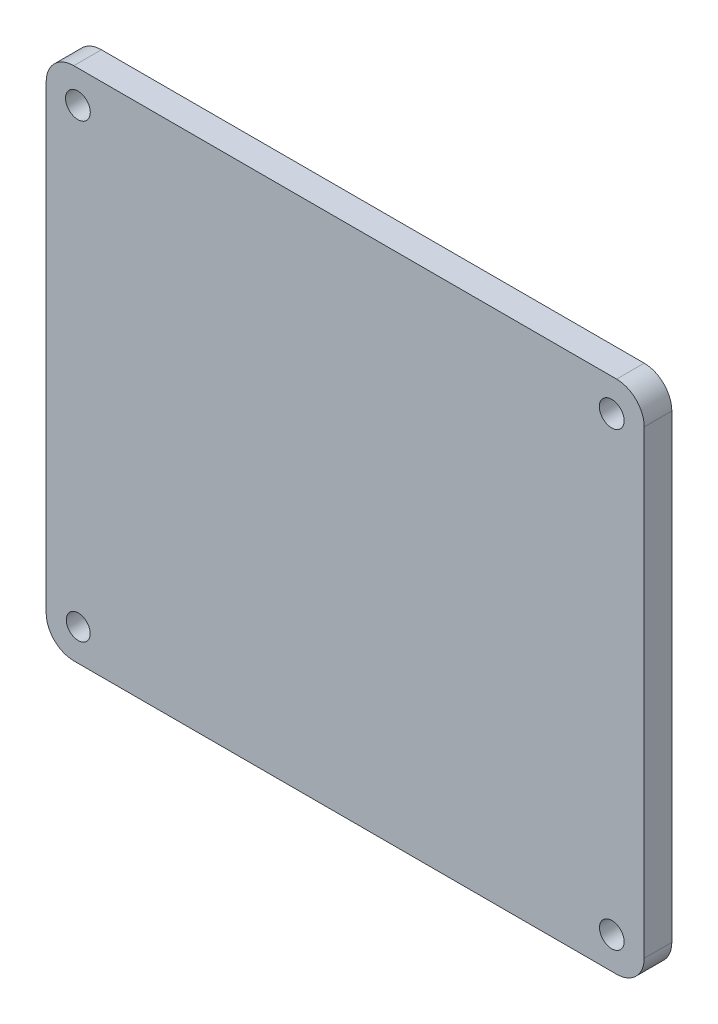
ISO-10303-21;
HEADER;
FILE_DESCRIPTION(('STEP AP214'),'2;1');
FILE_NAME('part.step','',(''),(''),'','','');
FILE_SCHEMA(('AUTOMOTIVE_DESIGN { 1 0 10303 214 1 1 1 1 }'));
ENDSEC;
DATA;
#1=APPLICATION_CONTEXT('core data for automotive mechanical design processes');
#2=APPLICATION_PROTOCOL_DEFINITION('international standard','automotive_design',2000,#1);
#3=PRODUCT_CONTEXT('',#1,'mechanical');
#4=PRODUCT('Part','Part','',(#3));
#5=PRODUCT_RELATED_PRODUCT_CATEGORY('part','',(#4));
#6=PRODUCT_DEFINITION_FORMATION('','',#4);
#7=PRODUCT_DEFINITION_CONTEXT('part definition',#1,'design');
#8=PRODUCT_DEFINITION('design','',#6,#7);
#9=PRODUCT_DEFINITION_SHAPE('','',#8);
#10=(LENGTH_UNIT() NAMED_UNIT(*) SI_UNIT(.MILLI.,.METRE.));
#11=(NAMED_UNIT(*) PLANE_ANGLE_UNIT() SI_UNIT($,.RADIAN.));
#12=(NAMED_UNIT(*) SI_UNIT($,.STERADIAN.) SOLID_ANGLE_UNIT());
#13=UNCERTAINTY_MEASURE_WITH_UNIT(LENGTH_MEASURE(1.E-05),#10,'distance_accuracy_value','');
#14=(GEOMETRIC_REPRESENTATION_CONTEXT(3) GLOBAL_UNCERTAINTY_ASSIGNED_CONTEXT((#13)) GLOBAL_UNIT_ASSIGNED_CONTEXT((#10,
#11,#12)) REPRESENTATION_CONTEXT('',''));
#15=CARTESIAN_POINT('',(0.,0.,0.));
#16=DIRECTION('',(0.,0.,1.));
#17=DIRECTION('',(1.,0.,0.));
#18=AXIS2_PLACEMENT_3D('',#15,#16,#17);
#19=CARTESIAN_POINT('',(201.871913251507,253.348131253436,3.));
#20=DIRECTION('',(0.,0.,-1.));
#21=DIRECTION('',(-1.,0.,0.));
#22=AXIS2_PLACEMENT_3D('',#19,#20,#21);
#23=PLANE('',#22);
#24=CARTESIAN_POINT('',(201.871913251507,253.348131253436,3.));
#25=DIRECTION('',(0.,0.,1.));
#26=DIRECTION('',(-1.,0.,0.));
#27=AXIS2_PLACEMENT_3D('',#24,#25,#26);
#28=CIRCLE('',#27,3.);
#29=CARTESIAN_POINT('',(201.871913251507,250.348131253436,3.));
#30=VERTEX_POINT('',#29);
#31=CARTESIAN_POINT('',(204.871913251507,253.348131253436,3.));
#32=VERTEX_POINT('',#31);
#33=EDGE_CURVE('E164',#30,#32,#28,.T.);
#34=ORIENTED_EDGE('',*,*,#33,.T.);
#35=DIRECTION('',(0.,1.,0.));
#36=VECTOR('',#35,1.);
#37=CARTESIAN_POINT('',(204.871913251507,303.333520822125,3.));
#38=LINE('',#37,#36);
#39=CARTESIAN_POINT('',(204.871913251507,303.333520822125,3.));
#40=VERTEX_POINT('',#39);
#41=EDGE_CURVE('E100',#32,#40,#38,.T.);
#42=ORIENTED_EDGE('',*,*,#41,.T.);
#43=CARTESIAN_POINT('',(201.871913251507,303.333520822125,3.));
#44=DIRECTION('',(0.,0.,1.));
#45=DIRECTION('',(-1.,0.,0.));
#46=AXIS2_PLACEMENT_3D('',#43,#44,#45);
#47=CIRCLE('',#46,3.);
#48=CARTESIAN_POINT('',(201.871913251507,306.333520822125,3.));
#49=VERTEX_POINT('',#48);
#50=EDGE_CURVE('E185',#40,#49,#47,.T.);
#51=ORIENTED_EDGE('',*,*,#50,.T.);
#52=DIRECTION('',(-1.,0.,0.));
#53=VECTOR('',#52,1.);
#54=CARTESIAN_POINT('',(142.914343154071,306.333520822125,3.));
#55=LINE('',#54,#53);
#56=CARTESIAN_POINT('',(142.914343154071,306.333520822125,3.));
#57=VERTEX_POINT('',#56);
#58=EDGE_CURVE('E199',#49,#57,#55,.T.);
#59=ORIENTED_EDGE('',*,*,#58,.T.);
#60=CARTESIAN_POINT('',(142.914343154071,303.333520822125,3.));
#61=DIRECTION('',(0.,0.,1.));
#62=DIRECTION('',(1.,0.,0.));
#63=AXIS2_PLACEMENT_3D('',#60,#61,#62);
#64=CIRCLE('',#63,3.);
#65=CARTESIAN_POINT('',(139.914343154071,303.333520822125,3.));
#66=VERTEX_POINT('',#65);
#67=EDGE_CURVE('E119',#57,#66,#64,.T.);
#68=ORIENTED_EDGE('',*,*,#67,.T.);
#69=DIRECTION('',(0.,-1.,0.));
#70=VECTOR('',#69,1.);
#71=CARTESIAN_POINT('',(139.914343154071,253.348131253436,3.));
#72=LINE('',#71,#70);
#73=CARTESIAN_POINT('',(139.914343154071,253.348131253436,3.));
#74=VERTEX_POINT('',#73);
#75=EDGE_CURVE('E113',#66,#74,#72,.T.);
#76=ORIENTED_EDGE('',*,*,#75,.T.);
#77=CARTESIAN_POINT('',(142.914343154071,253.348131253436,3.));
#78=DIRECTION('',(0.,0.,1.));
#79=DIRECTION('',(-1.,0.,0.));
#80=AXIS2_PLACEMENT_3D('',#77,#78,#79);
#81=CIRCLE('',#80,3.);
#82=CARTESIAN_POINT('',(142.914343154071,250.348131253436,3.));
#83=VERTEX_POINT('',#82);
#84=EDGE_CURVE('E117',#74,#83,#81,.T.);
#85=ORIENTED_EDGE('',*,*,#84,.T.);
#86=DIRECTION('',(1.,0.,0.));
#87=VECTOR('',#86,1.);
#88=CARTESIAN_POINT('',(201.871913251507,250.348131253436,3.));
#89=LINE('',#88,#87);
#90=EDGE_CURVE('E57',#83,#30,#89,.T.);
#91=ORIENTED_EDGE('',*,*,#90,.T.);
#92=EDGE_LOOP('',(#34,#42,#51,#59,#68,#76,#85,#91));
#93=FACE_BOUND('',#92,.T.);
#94=CARTESIAN_POINT('',(143.360544481449,302.831604494432,3.));
#95=DIRECTION('',(0.,0.,1.));
#96=DIRECTION('',(1.,0.,0.));
#97=AXIS2_PLACEMENT_3D('',#94,#95,#96);
#98=CIRCLE('',#97,1.34534522063001);
#99=CARTESIAN_POINT('',(144.705889702079,302.831604494432,3.));
#100=VERTEX_POINT('',#99);
#101=EDGE_CURVE('E146',#100,#100,#98,.T.);
#102=ORIENTED_EDGE('',*,*,#101,.F.);
#103=EDGE_LOOP('',(#102));
#104=FACE_BOUND('',#103,.T.);
#105=CARTESIAN_POINT('',(201.344684378207,302.818633302361,3.));
#106=DIRECTION('',(0.,0.,1.));
#107=DIRECTION('',(1.,0.,0.));
#108=AXIS2_PLACEMENT_3D('',#105,#106,#107);
#109=CIRCLE('',#108,1.34690922053071);
#110=CARTESIAN_POINT('',(202.691593598737,302.818633302361,3.));
#111=VERTEX_POINT('',#110);
#112=EDGE_CURVE('E213',#111,#111,#109,.T.);
#113=ORIENTED_EDGE('',*,*,#112,.F.);
#114=EDGE_LOOP('',(#113));
#115=FACE_BOUND('',#114,.T.);
#116=CARTESIAN_POINT('',(143.395469298573,253.802031827382,3.));
#117=DIRECTION('',(0.,0.,1.));
#118=DIRECTION('',(1.,0.,0.));
#119=AXIS2_PLACEMENT_3D('',#116,#117,#118);
#120=CIRCLE('',#119,1.29861131616477);
#121=CARTESIAN_POINT('',(144.694080614738,253.802031827382,3.));
#122=VERTEX_POINT('',#121);
#123=EDGE_CURVE('E221',#122,#122,#120,.T.);
#124=ORIENTED_EDGE('',*,*,#123,.F.);
#125=EDGE_LOOP('',(#124));
#126=FACE_BOUND('',#125,.T.);
#127=CARTESIAN_POINT('',(201.354862045578,253.815125267861,3.));
#128=DIRECTION('',(0.,0.,1.));
#129=DIRECTION('',(1.,0.,0.));
#130=AXIS2_PLACEMENT_3D('',#127,#128,#129);
#131=CIRCLE('',#130,1.3356837614244);
#132=CARTESIAN_POINT('',(202.690545807002,253.815125267861,3.));
#133=VERTEX_POINT('',#132);
#134=EDGE_CURVE('E229',#133,#133,#131,.T.);
#135=ORIENTED_EDGE('',*,*,#134,.F.);
#136=EDGE_LOOP('',(#135));
#137=FACE_BOUND('',#136,.T.);
#138=ADVANCED_FACE('F39',(#93,#104,#115,#126,#137),#23,.F.);
#139=CARTESIAN_POINT('',(201.871913251507,253.348131253436,0.));
#140=DIRECTION('',(0.,0.,-1.));
#141=DIRECTION('',(-1.,0.,0.));
#142=AXIS2_PLACEMENT_3D('',#139,#140,#141);
#143=PLANE('',#142);
#144=CARTESIAN_POINT('',(143.395469298573,253.802031827382,0.));
#145=DIRECTION('',(0.,0.,1.));
#146=DIRECTION('',(1.,0.,0.));
#147=AXIS2_PLACEMENT_3D('',#144,#145,#146);
#148=CIRCLE('',#147,1.29861131616477);
#149=CARTESIAN_POINT('',(144.694080614738,253.802031827382,0.));
#150=VERTEX_POINT('',#149);
#151=EDGE_CURVE('E225',#150,#150,#148,.T.);
#152=ORIENTED_EDGE('',*,*,#151,.T.);
#153=EDGE_LOOP('',(#152));
#154=FACE_BOUND('',#153,.T.);
#155=CARTESIAN_POINT('',(143.360544481449,302.831604494432,0.));
#156=DIRECTION('',(0.,0.,1.));
#157=DIRECTION('',(1.,0.,0.));
#158=AXIS2_PLACEMENT_3D('',#155,#156,#157);
#159=CIRCLE('',#158,1.34534522063001);
#160=CARTESIAN_POINT('',(144.705889702079,302.831604494432,0.));
#161=VERTEX_POINT('',#160);
#162=EDGE_CURVE('E209',#161,#161,#159,.T.);
#163=ORIENTED_EDGE('',*,*,#162,.T.);
#164=EDGE_LOOP('',(#163));
#165=FACE_BOUND('',#164,.T.);
#166=CARTESIAN_POINT('',(201.871913251507,253.348131253436,0.));
#167=DIRECTION('',(0.,0.,1.));
#168=DIRECTION('',(-1.,0.,0.));
#169=AXIS2_PLACEMENT_3D('',#166,#167,#168);
#170=CIRCLE('',#169,3.);
#171=CARTESIAN_POINT('',(201.871913251507,250.348131253436,0.));
#172=VERTEX_POINT('',#171);
#173=CARTESIAN_POINT('',(204.871913251507,253.348131253436,0.));
#174=VERTEX_POINT('',#173);
#175=EDGE_CURVE('E141',#172,#174,#170,.T.);
#176=ORIENTED_EDGE('',*,*,#175,.F.);
#177=DIRECTION('',(1.,0.,0.));
#178=VECTOR('',#177,1.);
#179=CARTESIAN_POINT('',(201.871913251507,250.348131253436,0.));
#180=LINE('',#179,#178);
#181=CARTESIAN_POINT('',(142.914343154071,250.348131253436,0.));
#182=VERTEX_POINT('',#181);
#183=EDGE_CURVE('E92',#182,#172,#180,.T.);
#184=ORIENTED_EDGE('',*,*,#183,.F.);
#185=CARTESIAN_POINT('',(142.914343154071,253.348131253436,0.));
#186=DIRECTION('',(0.,0.,1.));
#187=DIRECTION('',(-1.,0.,0.));
#188=AXIS2_PLACEMENT_3D('',#185,#186,#187);
#189=CIRCLE('',#188,3.);
#190=CARTESIAN_POINT('',(139.914343154071,253.348131253436,0.));
#191=VERTEX_POINT('',#190);
#192=EDGE_CURVE('E86',#191,#182,#189,.T.);
#193=ORIENTED_EDGE('',*,*,#192,.F.);
#194=DIRECTION('',(0.,-1.,0.));
#195=VECTOR('',#194,1.);
#196=CARTESIAN_POINT('',(139.914343154071,253.348131253436,0.));
#197=LINE('',#196,#195);
#198=CARTESIAN_POINT('',(139.914343154071,303.333520822125,0.));
#199=VERTEX_POINT('',#198);
#200=EDGE_CURVE('E128',#199,#191,#197,.T.);
#201=ORIENTED_EDGE('',*,*,#200,.F.);
#202=CARTESIAN_POINT('',(142.914343154071,303.333520822125,0.));
#203=DIRECTION('',(0.,0.,1.));
#204=DIRECTION('',(1.,0.,0.));
#205=AXIS2_PLACEMENT_3D('',#202,#203,#204);
#206=CIRCLE('',#205,3.);
#207=CARTESIAN_POINT('',(142.914343154071,306.333520822125,0.));
#208=VERTEX_POINT('',#207);
#209=EDGE_CURVE('E155',#208,#199,#206,.T.);
#210=ORIENTED_EDGE('',*,*,#209,.F.);
#211=DIRECTION('',(-1.,0.,0.));
#212=VECTOR('',#211,1.);
#213=CARTESIAN_POINT('',(142.914343154071,306.333520822125,0.));
#214=LINE('',#213,#212);
#215=CARTESIAN_POINT('',(201.871913251507,306.333520822125,0.));
#216=VERTEX_POINT('',#215);
#217=EDGE_CURVE('E152',#216,#208,#214,.T.);
#218=ORIENTED_EDGE('',*,*,#217,.F.);
#219=CARTESIAN_POINT('',(201.871913251507,303.333520822125,0.));
#220=DIRECTION('',(0.,0.,1.));
#221=DIRECTION('',(-1.,0.,0.));
#222=AXIS2_PLACEMENT_3D('',#219,#220,#221);
#223=CIRCLE('',#222,3.);
#224=CARTESIAN_POINT('',(204.871913251507,303.333520822125,0.));
#225=VERTEX_POINT('',#224);
#226=EDGE_CURVE('E149',#225,#216,#223,.T.);
#227=ORIENTED_EDGE('',*,*,#226,.F.);
#228=DIRECTION('',(0.,1.,0.));
#229=VECTOR('',#228,1.);
#230=CARTESIAN_POINT('',(204.871913251507,303.333520822125,0.));
#231=LINE('',#230,#229);
#232=EDGE_CURVE('E145',#174,#225,#231,.T.);
#233=ORIENTED_EDGE('',*,*,#232,.F.);
#234=EDGE_LOOP('',(#176,#184,#193,#201,#210,#218,#227,#233));
#235=FACE_BOUND('',#234,.T.);
#236=CARTESIAN_POINT('',(201.344684378207,302.818633302361,0.));
#237=DIRECTION('',(0.,0.,1.));
#238=DIRECTION('',(1.,0.,0.));
#239=AXIS2_PLACEMENT_3D('',#236,#237,#238);
#240=CIRCLE('',#239,1.34690922053071);
#241=CARTESIAN_POINT('',(202.691593598737,302.818633302361,0.));
#242=VERTEX_POINT('',#241);
#243=EDGE_CURVE('E217',#242,#242,#240,.T.);
#244=ORIENTED_EDGE('',*,*,#243,.T.);
#245=EDGE_LOOP('',(#244));
#246=FACE_BOUND('',#245,.T.);
#247=CARTESIAN_POINT('',(201.354862045578,253.815125267861,0.));
#248=DIRECTION('',(0.,0.,1.));
#249=DIRECTION('',(1.,0.,0.));
#250=AXIS2_PLACEMENT_3D('',#247,#248,#249);
#251=CIRCLE('',#250,1.3356837614244);
#252=CARTESIAN_POINT('',(202.690545807002,253.815125267861,0.));
#253=VERTEX_POINT('',#252);
#254=EDGE_CURVE('E233',#253,#253,#251,.T.);
#255=ORIENTED_EDGE('',*,*,#254,.T.);
#256=EDGE_LOOP('',(#255));
#257=FACE_BOUND('',#256,.T.);
#258=ADVANCED_FACE('F189',(#154,#165,#235,#246,#257),#143,.T.);
#259=CARTESIAN_POINT('',(201.871913251507,253.348131253436,3.));
#260=DIRECTION('',(0.,0.,-1.));
#261=DIRECTION('',(-1.,0.,0.));
#262=AXIS2_PLACEMENT_3D('',#259,#260,#261);
#263=CYLINDRICAL_SURFACE('',#262,3.);
#264=ORIENTED_EDGE('',*,*,#175,.T.);
#265=DIRECTION('',(0.,0.,-1.));
#266=VECTOR('',#265,1.);
#267=CARTESIAN_POINT('',(204.871913251507,253.348131253436,3.));
#268=LINE('',#267,#266);
#269=EDGE_CURVE('E11',#32,#174,#268,.T.);
#270=ORIENTED_EDGE('',*,*,#269,.F.);
#271=ORIENTED_EDGE('',*,*,#33,.F.);
#272=DIRECTION('',(0.,0.,-1.));
#273=VECTOR('',#272,1.);
#274=CARTESIAN_POINT('',(201.871913251507,250.348131253436,3.));
#275=LINE('',#274,#273);
#276=EDGE_CURVE('E137',#30,#172,#275,.T.);
#277=ORIENTED_EDGE('',*,*,#276,.T.);
#278=EDGE_LOOP('',(#264,#270,#271,#277));
#279=FACE_BOUND('',#278,.T.);
#280=ADVANCED_FACE('F41',(#279),#263,.T.);
#281=CARTESIAN_POINT('',(204.871913251507,303.333520822125,3.));
#282=DIRECTION('',(-1.,0.,0.));
#283=DIRECTION('',(0.,0.,1.));
#284=AXIS2_PLACEMENT_3D('',#281,#282,#283);
#285=PLANE('',#284);
#286=ORIENTED_EDGE('',*,*,#232,.T.);
#287=DIRECTION('',(0.,0.,-1.));
#288=VECTOR('',#287,1.);
#289=CARTESIAN_POINT('',(204.871913251507,303.333520822125,3.));
#290=LINE('',#289,#288);
#291=EDGE_CURVE('E49',#40,#225,#290,.T.);
#292=ORIENTED_EDGE('',*,*,#291,.F.);
#293=ORIENTED_EDGE('',*,*,#41,.F.);
#294=ORIENTED_EDGE('',*,*,#269,.T.);
#295=EDGE_LOOP('',(#286,#292,#293,#294));
#296=FACE_BOUND('',#295,.T.);
#297=ADVANCED_FACE('F267',(#296),#285,.F.);
#298=CARTESIAN_POINT('',(201.871913251507,303.333520822125,3.));
#299=DIRECTION('',(0.,0.,-1.));
#300=DIRECTION('',(-1.,0.,0.));
#301=AXIS2_PLACEMENT_3D('',#298,#299,#300);
#302=CYLINDRICAL_SURFACE('',#301,3.);
#303=ORIENTED_EDGE('',*,*,#226,.T.);
#304=DIRECTION('',(0.,0.,-1.));
#305=VECTOR('',#304,1.);
#306=CARTESIAN_POINT('',(201.871913251507,306.333520822125,3.));
#307=LINE('',#306,#305);
#308=EDGE_CURVE('E175',#49,#216,#307,.T.);
#309=ORIENTED_EDGE('',*,*,#308,.F.);
#310=ORIENTED_EDGE('',*,*,#50,.F.);
#311=ORIENTED_EDGE('',*,*,#291,.T.);
#312=EDGE_LOOP('',(#303,#309,#310,#311));
#313=FACE_BOUND('',#312,.T.);
#314=ADVANCED_FACE('F183',(#313),#302,.T.);
#315=CARTESIAN_POINT('',(142.914343154071,306.333520822125,3.));
#316=DIRECTION('',(0.,-1.,0.));
#317=DIRECTION('',(0.,0.,-1.));
#318=AXIS2_PLACEMENT_3D('',#315,#316,#317);
#319=PLANE('',#318);
#320=ORIENTED_EDGE('',*,*,#217,.T.);
#321=DIRECTION('',(0.,0.,-1.));
#322=VECTOR('',#321,1.);
#323=CARTESIAN_POINT('',(142.914343154071,306.333520822125,3.));
#324=LINE('',#323,#322);
#325=EDGE_CURVE('E171',#57,#208,#324,.T.);
#326=ORIENTED_EDGE('',*,*,#325,.F.);
#327=ORIENTED_EDGE('',*,*,#58,.F.);
#328=ORIENTED_EDGE('',*,*,#308,.T.);
#329=EDGE_LOOP('',(#320,#326,#327,#328));
#330=FACE_BOUND('',#329,.T.);
#331=ADVANCED_FACE('F194',(#330),#319,.F.);
#332=CARTESIAN_POINT('',(142.914343154071,303.333520822125,3.));
#333=DIRECTION('',(0.,0.,-1.));
#334=DIRECTION('',(-1.,0.,0.));
#335=AXIS2_PLACEMENT_3D('',#332,#333,#334);
#336=CYLINDRICAL_SURFACE('',#335,3.);
#337=ORIENTED_EDGE('',*,*,#209,.T.);
#338=DIRECTION('',(0.,0.,-1.));
#339=VECTOR('',#338,1.);
#340=CARTESIAN_POINT('',(139.914343154071,303.333520822125,3.));
#341=LINE('',#340,#339);
#342=EDGE_CURVE('E130',#66,#199,#341,.T.);
#343=ORIENTED_EDGE('',*,*,#342,.F.);
#344=ORIENTED_EDGE('',*,*,#67,.F.);
#345=ORIENTED_EDGE('',*,*,#325,.T.);
#346=EDGE_LOOP('',(#337,#343,#344,#345));
#347=FACE_BOUND('',#346,.T.);
#348=ADVANCED_FACE('F197',(#347),#336,.T.);
#349=CARTESIAN_POINT('',(139.914343154071,253.348131253436,3.));
#350=DIRECTION('',(1.,0.,0.));
#351=DIRECTION('',(0.,0.,-1.));
#352=AXIS2_PLACEMENT_3D('',#349,#350,#351);
#353=PLANE('',#352);
#354=ORIENTED_EDGE('',*,*,#200,.T.);
#355=DIRECTION('',(0.,0.,-1.));
#356=VECTOR('',#355,1.);
#357=CARTESIAN_POINT('',(139.914343154071,253.348131253436,3.));
#358=LINE('',#357,#356);
#359=EDGE_CURVE('E125',#74,#191,#358,.T.);
#360=ORIENTED_EDGE('',*,*,#359,.F.);
#361=ORIENTED_EDGE('',*,*,#75,.F.);
#362=ORIENTED_EDGE('',*,*,#342,.T.);
#363=EDGE_LOOP('',(#354,#360,#361,#362));
#364=FACE_BOUND('',#363,.T.);
#365=ADVANCED_FACE('F126',(#364),#353,.F.);
#366=CARTESIAN_POINT('',(142.914343154071,253.348131253436,3.));
#367=DIRECTION('',(0.,0.,-1.));
#368=DIRECTION('',(-1.,0.,0.));
#369=AXIS2_PLACEMENT_3D('',#366,#367,#368);
#370=CYLINDRICAL_SURFACE('',#369,3.);
#371=ORIENTED_EDGE('',*,*,#192,.T.);
#372=DIRECTION('',(0.,0.,-1.));
#373=VECTOR('',#372,1.);
#374=CARTESIAN_POINT('',(142.914343154071,250.348131253436,3.));
#375=LINE('',#374,#373);
#376=EDGE_CURVE('E131',#83,#182,#375,.T.);
#377=ORIENTED_EDGE('',*,*,#376,.F.);
#378=ORIENTED_EDGE('',*,*,#84,.F.);
#379=ORIENTED_EDGE('',*,*,#359,.T.);
#380=EDGE_LOOP('',(#371,#377,#378,#379));
#381=FACE_BOUND('',#380,.T.);
#382=ADVANCED_FACE('F133',(#381),#370,.T.);
#383=CARTESIAN_POINT('',(201.871913251507,250.348131253436,3.));
#384=DIRECTION('',(0.,1.,0.));
#385=DIRECTION('',(0.,0.,1.));
#386=AXIS2_PLACEMENT_3D('',#383,#384,#385);
#387=PLANE('',#386);
#388=ORIENTED_EDGE('',*,*,#183,.T.);
#389=ORIENTED_EDGE('',*,*,#276,.F.);
#390=ORIENTED_EDGE('',*,*,#90,.F.);
#391=ORIENTED_EDGE('',*,*,#376,.T.);
#392=EDGE_LOOP('',(#388,#389,#390,#391));
#393=FACE_BOUND('',#392,.T.);
#394=ADVANCED_FACE('F255',(#393),#387,.F.);
#395=CARTESIAN_POINT('',(143.360544481449,302.831604494432,3.));
#396=DIRECTION('',(0.,0.,-1.));
#397=DIRECTION('',(-1.,0.,0.));
#398=AXIS2_PLACEMENT_3D('',#395,#396,#397);
#399=CYLINDRICAL_SURFACE('',#398,1.34534522063001);
#400=ORIENTED_EDGE('',*,*,#101,.T.);
#401=EDGE_LOOP('',(#400));
#402=FACE_BOUND('',#401,.T.);
#403=ORIENTED_EDGE('',*,*,#162,.F.);
#404=EDGE_LOOP('',(#403));
#405=FACE_BOUND('',#404,.T.);
#406=ADVANCED_FACE('F252',(#402,#405),#399,.F.);
#407=CARTESIAN_POINT('',(201.344684378207,302.818633302361,3.));
#408=DIRECTION('',(0.,0.,-1.));
#409=DIRECTION('',(-1.,0.,0.));
#410=AXIS2_PLACEMENT_3D('',#407,#408,#409);
#411=CYLINDRICAL_SURFACE('',#410,1.34690922053071);
#412=ORIENTED_EDGE('',*,*,#112,.T.);
#413=EDGE_LOOP('',(#412));
#414=FACE_BOUND('',#413,.T.);
#415=ORIENTED_EDGE('',*,*,#243,.F.);
#416=EDGE_LOOP('',(#415));
#417=FACE_BOUND('',#416,.T.);
#418=ADVANCED_FACE('F331',(#414,#417),#411,.F.);
#419=CARTESIAN_POINT('',(143.395469298573,253.802031827382,3.));
#420=DIRECTION('',(0.,0.,-1.));
#421=DIRECTION('',(-1.,0.,0.));
#422=AXIS2_PLACEMENT_3D('',#419,#420,#421);
#423=CYLINDRICAL_SURFACE('',#422,1.29861131616477);
#424=ORIENTED_EDGE('',*,*,#123,.T.);
#425=EDGE_LOOP('',(#424));
#426=FACE_BOUND('',#425,.T.);
#427=ORIENTED_EDGE('',*,*,#151,.F.);
#428=EDGE_LOOP('',(#427));
#429=FACE_BOUND('',#428,.T.);
#430=ADVANCED_FACE('F339',(#426,#429),#423,.F.);
#431=CARTESIAN_POINT('',(201.354862045578,253.815125267861,3.));
#432=DIRECTION('',(0.,0.,-1.));
#433=DIRECTION('',(-1.,0.,0.));
#434=AXIS2_PLACEMENT_3D('',#431,#432,#433);
#435=CYLINDRICAL_SURFACE('',#434,1.3356837614244);
#436=ORIENTED_EDGE('',*,*,#134,.T.);
#437=EDGE_LOOP('',(#436));
#438=FACE_BOUND('',#437,.T.);
#439=ORIENTED_EDGE('',*,*,#254,.F.);
#440=EDGE_LOOP('',(#439));
#441=FACE_BOUND('',#440,.T.);
#442=ADVANCED_FACE('F241',(#438,#441),#435,.F.);
#443=CLOSED_SHELL('',(#138,#258,#280,#297,#314,#331,#348,#365,#382,#394,#406,#418,#430,#442));
#444=MANIFOLD_SOLID_BREP('B2',#443);
#445=ADVANCED_BREP_SHAPE_REPRESENTATION('',(#18,#444),#14);
#446=SHAPE_DEFINITION_REPRESENTATION(#9,#445);
ENDSEC;
END-ISO-10303-21;
